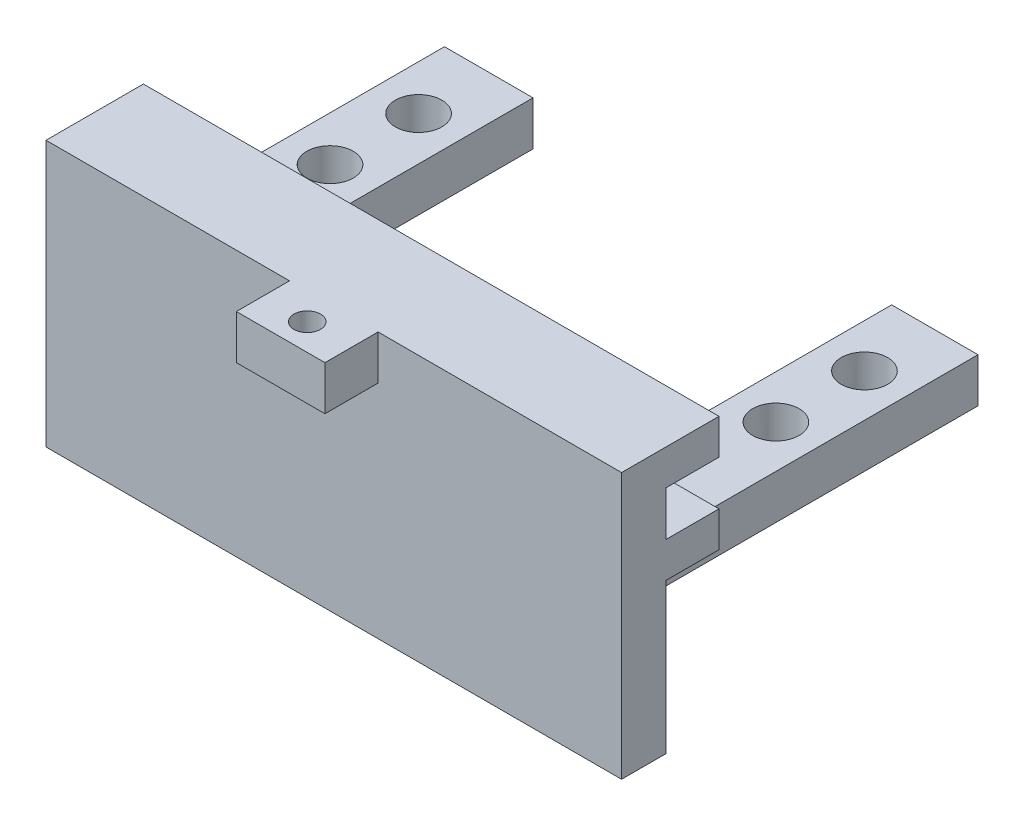
ISO-10303-21;
HEADER;
FILE_DESCRIPTION(('STEP AP214'),'2;1');
FILE_NAME('part.step','',(''),(''),'','','');
FILE_SCHEMA(('AUTOMOTIVE_DESIGN { 1 0 10303 214 1 1 1 1 }'));
ENDSEC;
DATA;
#1=APPLICATION_CONTEXT('core data for automotive mechanical design processes');
#2=APPLICATION_PROTOCOL_DEFINITION('international standard','automotive_design',2000,#1);
#3=PRODUCT_CONTEXT('',#1,'mechanical');
#4=PRODUCT('Part','Part','',(#3));
#5=PRODUCT_RELATED_PRODUCT_CATEGORY('part','',(#4));
#6=PRODUCT_DEFINITION_FORMATION('','',#4);
#7=PRODUCT_DEFINITION_CONTEXT('part definition',#1,'design');
#8=PRODUCT_DEFINITION('design','',#6,#7);
#9=PRODUCT_DEFINITION_SHAPE('','',#8);
#10=(LENGTH_UNIT() NAMED_UNIT(*) SI_UNIT(.MILLI.,.METRE.));
#11=(NAMED_UNIT(*) PLANE_ANGLE_UNIT() SI_UNIT($,.RADIAN.));
#12=(NAMED_UNIT(*) SI_UNIT($,.STERADIAN.) SOLID_ANGLE_UNIT());
#13=UNCERTAINTY_MEASURE_WITH_UNIT(LENGTH_MEASURE(1.E-05),#10,'distance_accuracy_value','');
#14=(GEOMETRIC_REPRESENTATION_CONTEXT(3) GLOBAL_UNCERTAINTY_ASSIGNED_CONTEXT((#13)) GLOBAL_UNIT_ASSIGNED_CONTEXT((#10,
#11,#12)) REPRESENTATION_CONTEXT('',''));
#15=CARTESIAN_POINT('',(0.,0.,0.));
#16=DIRECTION('',(0.,0.,1.));
#17=DIRECTION('',(1.,0.,0.));
#18=AXIS2_PLACEMENT_3D('',#15,#16,#17);
#19=CARTESIAN_POINT('',(0.,0.,0.));
#20=DIRECTION('',(0.,0.,-1.));
#21=DIRECTION('',(1.,0.,0.));
#22=AXIS2_PLACEMENT_3D('',#19,#20,#21);
#23=PLANE('',#22);
#24=DIRECTION('',(0.,1.,0.));
#25=VECTOR('',#24,1.);
#26=CARTESIAN_POINT('',(-7.50000000000002,10.,0.));
#27=LINE('',#26,#25);
#28=CARTESIAN_POINT('',(-7.50000000000002,10.,0.));
#29=VERTEX_POINT('',#28);
#30=CARTESIAN_POINT('',(-7.50000000000002,15.,0.));
#31=VERTEX_POINT('',#30);
#32=EDGE_CURVE('E210',#29,#31,#27,.T.);
#33=ORIENTED_EDGE('',*,*,#32,.T.);
#34=DIRECTION('',(-1.,0.,0.));
#35=VECTOR('',#34,1.);
#36=CARTESIAN_POINT('',(-30.,15.,0.));
#37=LINE('',#36,#35);
#38=CARTESIAN_POINT('',(-35.,15.,0.));
#39=VERTEX_POINT('',#38);
#40=EDGE_CURVE('E369',#31,#39,#37,.T.);
#41=ORIENTED_EDGE('',*,*,#40,.T.);
#42=DIRECTION('',(0.,-1.,0.));
#43=VECTOR('',#42,1.);
#44=CARTESIAN_POINT('',(-35.,15.,0.));
#45=LINE('',#44,#43);
#46=CARTESIAN_POINT('',(-35.,-15.,0.));
#47=VERTEX_POINT('',#46);
#48=EDGE_CURVE('E263',#39,#47,#45,.T.);
#49=ORIENTED_EDGE('',*,*,#48,.T.);
#50=DIRECTION('',(1.,0.,0.));
#51=VECTOR('',#50,1.);
#52=CARTESIAN_POINT('',(-30.,-15.,0.));
#53=LINE('',#52,#51);
#54=CARTESIAN_POINT('',(30.,-15.,0.));
#55=VERTEX_POINT('',#54);
#56=EDGE_CURVE('E372',#47,#55,#53,.T.);
#57=ORIENTED_EDGE('',*,*,#56,.T.);
#58=DIRECTION('',(0.,1.,0.));
#59=VECTOR('',#58,1.);
#60=CARTESIAN_POINT('',(30.,15.,0.));
#61=LINE('',#60,#59);
#62=CARTESIAN_POINT('',(30.,15.,0.));
#63=VERTEX_POINT('',#62);
#64=EDGE_CURVE('E359',#55,#63,#61,.T.);
#65=ORIENTED_EDGE('',*,*,#64,.T.);
#66=CARTESIAN_POINT('',(2.49999999999998,15.,0.));
#67=VERTEX_POINT('',#66);
#68=EDGE_CURVE('E370',#63,#67,#37,.T.);
#69=ORIENTED_EDGE('',*,*,#68,.T.);
#70=DIRECTION('',(0.,1.,0.));
#71=VECTOR('',#70,1.);
#72=CARTESIAN_POINT('',(2.49999999999998,10.,0.));
#73=LINE('',#72,#71);
#74=CARTESIAN_POINT('',(2.49999999999998,10.,0.));
#75=VERTEX_POINT('',#74);
#76=EDGE_CURVE('E212',#75,#67,#73,.T.);
#77=ORIENTED_EDGE('',*,*,#76,.F.);
#78=DIRECTION('',(1.,0.,0.));
#79=VECTOR('',#78,1.);
#80=CARTESIAN_POINT('',(-7.50000000000002,10.,0.));
#81=LINE('',#80,#79);
#82=EDGE_CURVE('E198',#29,#75,#81,.T.);
#83=ORIENTED_EDGE('',*,*,#82,.F.);
#84=EDGE_LOOP('',(#33,#41,#49,#57,#65,#69,#77,#83));
#85=FACE_BOUND('',#84,.T.);
#86=ADVANCED_FACE('F41',(#85),#23,.F.);
#87=CARTESIAN_POINT('',(0.,0.,-5.));
#88=DIRECTION('',(0.,0.,-1.));
#89=DIRECTION('',(1.,0.,0.));
#90=AXIS2_PLACEMENT_3D('',#87,#88,#89);
#91=PLANE('',#90);
#92=DIRECTION('',(0.,1.,0.));
#93=VECTOR('',#92,1.);
#94=CARTESIAN_POINT('',(-35.,-15.,-5.));
#95=LINE('',#94,#93);
#96=CARTESIAN_POINT('',(-35.,1.64999999999999,-5.));
#97=VERTEX_POINT('',#96);
#98=CARTESIAN_POINT('',(-35.,1.95,-5.));
#99=VERTEX_POINT('',#98);
#100=EDGE_CURVE('E242',#97,#99,#95,.T.);
#101=ORIENTED_EDGE('',*,*,#100,.T.);
#102=DIRECTION('',(1.,0.,0.));
#103=VECTOR('',#102,1.);
#104=CARTESIAN_POINT('',(-30.,1.95,-5.));
#105=LINE('',#104,#103);
#106=CARTESIAN_POINT('',(30.,1.95,-5.));
#107=VERTEX_POINT('',#106);
#108=EDGE_CURVE('E337',#99,#107,#105,.T.);
#109=ORIENTED_EDGE('',*,*,#108,.T.);
#110=DIRECTION('',(0.,1.,0.));
#111=VECTOR('',#110,1.);
#112=CARTESIAN_POINT('',(30.,15.,-5.));
#113=LINE('',#112,#111);
#114=CARTESIAN_POINT('',(30.,-15.,-5.));
#115=VERTEX_POINT('',#114);
#116=EDGE_CURVE('E360',#115,#107,#113,.T.);
#117=ORIENTED_EDGE('',*,*,#116,.F.);
#118=DIRECTION('',(1.,0.,0.));
#119=VECTOR('',#118,1.);
#120=CARTESIAN_POINT('',(-30.,-15.,-5.));
#121=LINE('',#120,#119);
#122=CARTESIAN_POINT('',(-35.,-15.,-5.));
#123=VERTEX_POINT('',#122);
#124=EDGE_CURVE('E363',#123,#115,#121,.T.);
#125=ORIENTED_EDGE('',*,*,#124,.F.);
#126=CARTESIAN_POINT('',(-35.,-3.35000000000001,-5.));
#127=VERTEX_POINT('',#126);
#128=EDGE_CURVE('E243',#123,#127,#95,.T.);
#129=ORIENTED_EDGE('',*,*,#128,.T.);
#130=DIRECTION('',(1.,0.,0.));
#131=VECTOR('',#130,1.);
#132=CARTESIAN_POINT('',(-30.,-3.35000000000001,-5.));
#133=LINE('',#132,#131);
#134=CARTESIAN_POINT('',(-25.,-3.35000000000001,-5.));
#135=VERTEX_POINT('',#134);
#136=EDGE_CURVE('E305',#127,#135,#133,.T.);
#137=ORIENTED_EDGE('',*,*,#136,.T.);
#138=DIRECTION('',(0.,1.,0.));
#139=VECTOR('',#138,1.);
#140=CARTESIAN_POINT('',(-25.,-3.35000000000001,-5.));
#141=LINE('',#140,#139);
#142=CARTESIAN_POINT('',(-25.,1.64999999999999,-5.));
#143=VERTEX_POINT('',#142);
#144=EDGE_CURVE('E322',#135,#143,#141,.T.);
#145=ORIENTED_EDGE('',*,*,#144,.T.);
#146=DIRECTION('',(-1.,0.,0.));
#147=VECTOR('',#146,1.);
#148=CARTESIAN_POINT('',(-30.,1.64999999999999,-5.));
#149=LINE('',#148,#147);
#150=EDGE_CURVE('E314',#143,#97,#149,.T.);
#151=ORIENTED_EDGE('',*,*,#150,.T.);
#152=EDGE_LOOP('',(#101,#109,#117,#125,#129,#137,#145,#151));
#153=FACE_BOUND('',#152,.T.);
#154=DIRECTION('',(0.,-1.,0.));
#155=VECTOR('',#154,1.);
#156=CARTESIAN_POINT('',(15.5,1.64999999999999,-5.));
#157=LINE('',#156,#155);
#158=CARTESIAN_POINT('',(15.5,1.64999999999999,-5.));
#159=VERTEX_POINT('',#158);
#160=CARTESIAN_POINT('',(15.5,-3.35000000000001,-5.));
#161=VERTEX_POINT('',#160);
#162=EDGE_CURVE('E227',#159,#161,#157,.T.);
#163=ORIENTED_EDGE('',*,*,#162,.T.);
#164=DIRECTION('',(1.,0.,0.));
#165=VECTOR('',#164,1.);
#166=CARTESIAN_POINT('',(22.25,-3.35000000000001,-5.));
#167=LINE('',#166,#165);
#168=CARTESIAN_POINT('',(25.25,-3.35000000000001,-5.));
#169=VERTEX_POINT('',#168);
#170=EDGE_CURVE('E302',#161,#169,#167,.T.);
#171=ORIENTED_EDGE('',*,*,#170,.T.);
#172=DIRECTION('',(0.,1.,0.));
#173=VECTOR('',#172,1.);
#174=CARTESIAN_POINT('',(25.25,-3.35000000000001,-5.));
#175=LINE('',#174,#173);
#176=CARTESIAN_POINT('',(25.25,1.64999999999999,-5.));
#177=VERTEX_POINT('',#176);
#178=EDGE_CURVE('E289',#169,#177,#175,.T.);
#179=ORIENTED_EDGE('',*,*,#178,.T.);
#180=DIRECTION('',(-1.,0.,0.));
#181=VECTOR('',#180,1.);
#182=CARTESIAN_POINT('',(22.25,1.64999999999999,-5.));
#183=LINE('',#182,#181);
#184=EDGE_CURVE('E297',#177,#159,#183,.T.);
#185=ORIENTED_EDGE('',*,*,#184,.T.);
#186=EDGE_LOOP('',(#163,#171,#179,#185));
#187=FACE_BOUND('',#186,.T.);
#188=ADVANCED_FACE('F394',(#153,#187),#91,.T.);
#189=CARTESIAN_POINT('',(30.,15.,-5.));
#190=DIRECTION('',(-1.,0.,0.));
#191=DIRECTION('',(0.,-1.,0.));
#192=AXIS2_PLACEMENT_3D('',#189,#190,#191);
#193=PLANE('',#192);
#194=ORIENTED_EDGE('',*,*,#64,.F.);
#195=DIRECTION('',(0.,0.,1.));
#196=VECTOR('',#195,1.);
#197=CARTESIAN_POINT('',(30.,-15.,-5.));
#198=LINE('',#197,#196);
#199=EDGE_CURVE('E50',#115,#55,#198,.T.);
#200=ORIENTED_EDGE('',*,*,#199,.F.);
#201=ORIENTED_EDGE('',*,*,#116,.T.);
#202=DIRECTION('',(0.,0.,1.));
#203=VECTOR('',#202,1.);
#204=CARTESIAN_POINT('',(30.,1.95,-11.));
#205=LINE('',#204,#203);
#206=CARTESIAN_POINT('',(30.,1.95,-11.));
#207=VERTEX_POINT('',#206);
#208=EDGE_CURVE('E329',#207,#107,#205,.T.);
#209=ORIENTED_EDGE('',*,*,#208,.F.);
#210=DIRECTION('',(0.,-1.,0.));
#211=VECTOR('',#210,1.);
#212=CARTESIAN_POINT('',(30.,5.95,-11.));
#213=LINE('',#212,#211);
#214=CARTESIAN_POINT('',(30.,5.95,-11.));
#215=VERTEX_POINT('',#214);
#216=EDGE_CURVE('E343',#215,#207,#213,.T.);
#217=ORIENTED_EDGE('',*,*,#216,.F.);
#218=DIRECTION('',(0.,0.,1.));
#219=VECTOR('',#218,1.);
#220=CARTESIAN_POINT('',(30.,5.95,-11.));
#221=LINE('',#220,#219);
#222=CARTESIAN_POINT('',(30.,5.95,-5.));
#223=VERTEX_POINT('',#222);
#224=EDGE_CURVE('E331',#215,#223,#221,.T.);
#225=ORIENTED_EDGE('',*,*,#224,.T.);
#226=CARTESIAN_POINT('',(30.,11.,-5.));
#227=VERTEX_POINT('',#226);
#228=EDGE_CURVE('E364',#223,#227,#113,.T.);
#229=ORIENTED_EDGE('',*,*,#228,.T.);
#230=DIRECTION('',(0.,0.,1.));
#231=VECTOR('',#230,1.);
#232=CARTESIAN_POINT('',(30.,11.,-11.));
#233=LINE('',#232,#231);
#234=CARTESIAN_POINT('',(30.,11.,-11.));
#235=VERTEX_POINT('',#234);
#236=EDGE_CURVE('E355',#235,#227,#233,.T.);
#237=ORIENTED_EDGE('',*,*,#236,.F.);
#238=DIRECTION('',(0.,1.,0.));
#239=VECTOR('',#238,1.);
#240=CARTESIAN_POINT('',(30.,0.,-11.));
#241=LINE('',#240,#239);
#242=CARTESIAN_POINT('',(30.,15.,-11.));
#243=VERTEX_POINT('',#242);
#244=EDGE_CURVE('E349',#235,#243,#241,.T.);
#245=ORIENTED_EDGE('',*,*,#244,.T.);
#246=DIRECTION('',(0.,0.,1.));
#247=VECTOR('',#246,1.);
#248=CARTESIAN_POINT('',(30.,15.,-5.));
#249=LINE('',#248,#247);
#250=EDGE_CURVE('E11',#243,#63,#249,.T.);
#251=ORIENTED_EDGE('',*,*,#250,.T.);
#252=EDGE_LOOP('',(#194,#200,#201,#209,#217,#225,#229,#237,#245,#251));
#253=FACE_BOUND('',#252,.T.);
#254=ADVANCED_FACE('F43',(#253),#193,.F.);
#255=CARTESIAN_POINT('',(-30.,15.,-5.));
#256=DIRECTION('',(0.,-1.,0.));
#257=DIRECTION('',(0.,0.,1.));
#258=AXIS2_PLACEMENT_3D('',#255,#256,#257);
#259=PLANE('',#258);
#260=ORIENTED_EDGE('',*,*,#68,.F.);
#261=ORIENTED_EDGE('',*,*,#250,.F.);
#262=DIRECTION('',(-1.,0.,0.));
#263=VECTOR('',#262,1.);
#264=CARTESIAN_POINT('',(0.,15.,-11.));
#265=LINE('',#264,#263);
#266=CARTESIAN_POINT('',(-35.,15.,-11.));
#267=VERTEX_POINT('',#266);
#268=EDGE_CURVE('E352',#243,#267,#265,.T.);
#269=ORIENTED_EDGE('',*,*,#268,.T.);
#270=DIRECTION('',(0.,0.,1.));
#271=VECTOR('',#270,1.);
#272=CARTESIAN_POINT('',(-35.,15.,-11.));
#273=LINE('',#272,#271);
#274=EDGE_CURVE('E261',#267,#39,#273,.T.);
#275=ORIENTED_EDGE('',*,*,#274,.T.);
#276=ORIENTED_EDGE('',*,*,#40,.F.);
#277=DIRECTION('',(0.,0.,-1.));
#278=VECTOR('',#277,1.);
#279=CARTESIAN_POINT('',(-7.50000000000002,15.,6.));
#280=LINE('',#279,#278);
#281=CARTESIAN_POINT('',(-7.50000000000002,15.,6.));
#282=VERTEX_POINT('',#281);
#283=EDGE_CURVE('E217',#282,#31,#280,.T.);
#284=ORIENTED_EDGE('',*,*,#283,.F.);
#285=DIRECTION('',(-1.,0.,0.));
#286=VECTOR('',#285,1.);
#287=CARTESIAN_POINT('',(2.49999999999998,15.,6.));
#288=LINE('',#287,#286);
#289=CARTESIAN_POINT('',(2.49999999999998,15.,6.));
#290=VERTEX_POINT('',#289);
#291=EDGE_CURVE('E205',#290,#282,#288,.T.);
#292=ORIENTED_EDGE('',*,*,#291,.F.);
#293=DIRECTION('',(0.,0.,1.));
#294=VECTOR('',#293,1.);
#295=CARTESIAN_POINT('',(2.49999999999998,15.,0.));
#296=LINE('',#295,#294);
#297=EDGE_CURVE('E58',#67,#290,#296,.T.);
#298=ORIENTED_EDGE('',*,*,#297,.F.);
#299=EDGE_LOOP('',(#260,#261,#269,#275,#276,#284,#292,#298));
#300=FACE_BOUND('',#299,.T.);
#301=CARTESIAN_POINT('',(-2.50000000000002,15.,3.));
#302=DIRECTION('',(0.,-1.,0.));
#303=DIRECTION('',(0.,0.,-1.));
#304=AXIS2_PLACEMENT_3D('',#301,#302,#303);
#305=CIRCLE('',#304,1.5);
#306=CARTESIAN_POINT('',(-2.50000000000002,15.,1.5));
#307=VERTEX_POINT('',#306);
#308=EDGE_CURVE('E454',#307,#307,#305,.T.);
#309=ORIENTED_EDGE('',*,*,#308,.T.);
#310=EDGE_LOOP('',(#309));
#311=FACE_BOUND('',#310,.T.);
#312=ADVANCED_FACE('F445',(#300,#311),#259,.F.);
#313=CARTESIAN_POINT('',(-30.,-15.,-5.));
#314=DIRECTION('',(0.,1.,0.));
#315=DIRECTION('',(0.,0.,-1.));
#316=AXIS2_PLACEMENT_3D('',#313,#314,#315);
#317=PLANE('',#316);
#318=ORIENTED_EDGE('',*,*,#56,.F.);
#319=DIRECTION('',(0.,0.,-1.));
#320=VECTOR('',#319,1.);
#321=CARTESIAN_POINT('',(-35.,-15.,0.));
#322=LINE('',#321,#320);
#323=EDGE_CURVE('E266',#47,#123,#322,.T.);
#324=ORIENTED_EDGE('',*,*,#323,.T.);
#325=ORIENTED_EDGE('',*,*,#124,.T.);
#326=ORIENTED_EDGE('',*,*,#199,.T.);
#327=EDGE_LOOP('',(#318,#324,#325,#326));
#328=FACE_BOUND('',#327,.T.);
#329=ADVANCED_FACE('F416',(#328),#317,.F.);
#330=DIRECTION('',(1.,0.,0.));
#331=VECTOR('',#330,1.);
#332=CARTESIAN_POINT('',(-30.,5.95,-5.));
#333=LINE('',#332,#331);
#334=CARTESIAN_POINT('',(-35.,5.95,-5.));
#335=VERTEX_POINT('',#334);
#336=EDGE_CURVE('E335',#335,#223,#333,.T.);
#337=ORIENTED_EDGE('',*,*,#336,.F.);
#338=DIRECTION('',(0.,1.,0.));
#339=VECTOR('',#338,1.);
#340=CARTESIAN_POINT('',(-35.,5.95,-5.));
#341=LINE('',#340,#339);
#342=CARTESIAN_POINT('',(-35.,11.,-5.));
#343=VERTEX_POINT('',#342);
#344=EDGE_CURVE('E253',#335,#343,#341,.T.);
#345=ORIENTED_EDGE('',*,*,#344,.T.);
#346=DIRECTION('',(1.,0.,0.));
#347=VECTOR('',#346,1.);
#348=CARTESIAN_POINT('',(0.,11.,-5.));
#349=LINE('',#348,#347);
#350=EDGE_CURVE('E341',#343,#227,#349,.T.);
#351=ORIENTED_EDGE('',*,*,#350,.T.);
#352=ORIENTED_EDGE('',*,*,#228,.F.);
#353=EDGE_LOOP('',(#337,#345,#351,#352));
#354=FACE_BOUND('',#353,.T.);
#355=ADVANCED_FACE('F441',(#354),#91,.T.);
#356=CARTESIAN_POINT('',(0.,11.,-11.));
#357=DIRECTION('',(0.,1.,0.));
#358=DIRECTION('',(0.,0.,-1.));
#359=AXIS2_PLACEMENT_3D('',#356,#357,#358);
#360=PLANE('',#359);
#361=ORIENTED_EDGE('',*,*,#350,.F.);
#362=DIRECTION('',(0.,0.,-1.));
#363=VECTOR('',#362,1.);
#364=CARTESIAN_POINT('',(-35.,11.,-5.));
#365=LINE('',#364,#363);
#366=CARTESIAN_POINT('',(-35.,11.,-11.));
#367=VERTEX_POINT('',#366);
#368=EDGE_CURVE('E256',#343,#367,#365,.T.);
#369=ORIENTED_EDGE('',*,*,#368,.T.);
#370=DIRECTION('',(1.,0.,0.));
#371=VECTOR('',#370,1.);
#372=CARTESIAN_POINT('',(0.,11.,-11.));
#373=LINE('',#372,#371);
#374=EDGE_CURVE('E347',#367,#235,#373,.T.);
#375=ORIENTED_EDGE('',*,*,#374,.T.);
#376=ORIENTED_EDGE('',*,*,#236,.T.);
#377=EDGE_LOOP('',(#361,#369,#375,#376));
#378=FACE_BOUND('',#377,.T.);
#379=ADVANCED_FACE('F479',(#378),#360,.F.);
#380=CARTESIAN_POINT('',(0.,0.,-11.));
#381=DIRECTION('',(0.,0.,-1.));
#382=DIRECTION('',(1.,0.,0.));
#383=AXIS2_PLACEMENT_3D('',#380,#381,#382);
#384=PLANE('',#383);
#385=ORIENTED_EDGE('',*,*,#268,.F.);
#386=ORIENTED_EDGE('',*,*,#244,.F.);
#387=ORIENTED_EDGE('',*,*,#374,.F.);
#388=DIRECTION('',(0.,1.,0.));
#389=VECTOR('',#388,1.);
#390=CARTESIAN_POINT('',(-35.,11.,-11.));
#391=LINE('',#390,#389);
#392=EDGE_CURVE('E259',#367,#267,#391,.T.);
#393=ORIENTED_EDGE('',*,*,#392,.T.);
#394=EDGE_LOOP('',(#385,#386,#387,#393));
#395=FACE_BOUND('',#394,.T.);
#396=ADVANCED_FACE('F475',(#395),#384,.T.);
#397=CARTESIAN_POINT('',(-30.,1.95,-11.));
#398=DIRECTION('',(0.,1.,0.));
#399=DIRECTION('',(-1.,0.,0.));
#400=AXIS2_PLACEMENT_3D('',#397,#398,#399);
#401=PLANE('',#400);
#402=ORIENTED_EDGE('',*,*,#108,.F.);
#403=DIRECTION('',(0.,0.,-1.));
#404=VECTOR('',#403,1.);
#405=CARTESIAN_POINT('',(-35.,1.95,-5.));
#406=LINE('',#405,#404);
#407=CARTESIAN_POINT('',(-35.,1.95,-11.));
#408=VERTEX_POINT('',#407);
#409=EDGE_CURVE('E246',#99,#408,#406,.T.);
#410=ORIENTED_EDGE('',*,*,#409,.T.);
#411=DIRECTION('',(1.,0.,0.));
#412=VECTOR('',#411,1.);
#413=CARTESIAN_POINT('',(-30.,1.95,-11.));
#414=LINE('',#413,#412);
#415=EDGE_CURVE('E338',#408,#207,#414,.T.);
#416=ORIENTED_EDGE('',*,*,#415,.T.);
#417=ORIENTED_EDGE('',*,*,#208,.T.);
#418=EDGE_LOOP('',(#402,#410,#416,#417));
#419=FACE_BOUND('',#418,.T.);
#420=ADVANCED_FACE('F408',(#419),#401,.F.);
#421=CARTESIAN_POINT('',(-30.,5.95,-11.));
#422=DIRECTION('',(0.,1.,0.));
#423=DIRECTION('',(-1.,0.,0.));
#424=AXIS2_PLACEMENT_3D('',#421,#422,#423);
#425=PLANE('',#424);
#426=ORIENTED_EDGE('',*,*,#336,.T.);
#427=ORIENTED_EDGE('',*,*,#224,.F.);
#428=DIRECTION('',(1.,0.,0.));
#429=VECTOR('',#428,1.);
#430=CARTESIAN_POINT('',(-30.,5.95,-11.));
#431=LINE('',#430,#429);
#432=CARTESIAN_POINT('',(-35.,5.95,-11.));
#433=VERTEX_POINT('',#432);
#434=EDGE_CURVE('E334',#433,#215,#431,.T.);
#435=ORIENTED_EDGE('',*,*,#434,.F.);
#436=DIRECTION('',(0.,0.,1.));
#437=VECTOR('',#436,1.);
#438=CARTESIAN_POINT('',(-35.,5.95,-11.));
#439=LINE('',#438,#437);
#440=EDGE_CURVE('E251',#433,#335,#439,.T.);
#441=ORIENTED_EDGE('',*,*,#440,.T.);
#442=EDGE_LOOP('',(#426,#427,#435,#441));
#443=FACE_BOUND('',#442,.T.);
#444=ADVANCED_FACE('F429',(#443),#425,.T.);
#445=CARTESIAN_POINT('',(0.,0.,-11.));
#446=DIRECTION('',(0.,0.,1.));
#447=DIRECTION('',(-1.,0.,0.));
#448=AXIS2_PLACEMENT_3D('',#445,#446,#447);
#449=PLANE('',#448);
#450=ORIENTED_EDGE('',*,*,#415,.F.);
#451=DIRECTION('',(0.,1.,0.));
#452=VECTOR('',#451,1.);
#453=CARTESIAN_POINT('',(-35.,1.95,-11.));
#454=LINE('',#453,#452);
#455=EDGE_CURVE('E249',#408,#433,#454,.T.);
#456=ORIENTED_EDGE('',*,*,#455,.T.);
#457=ORIENTED_EDGE('',*,*,#434,.T.);
#458=ORIENTED_EDGE('',*,*,#216,.T.);
#459=EDGE_LOOP('',(#450,#456,#457,#458));
#460=FACE_BOUND('',#459,.T.);
#461=ADVANCED_FACE('F421',(#460),#449,.F.);
#462=CARTESIAN_POINT('',(-30.,-3.35000000000001,-45.));
#463=DIRECTION('',(0.,1.,0.));
#464=DIRECTION('',(0.,0.,-1.));
#465=AXIS2_PLACEMENT_3D('',#462,#463,#464);
#466=PLANE('',#465);
#467=CARTESIAN_POINT('',(-29.925,-3.35000000000001,-37.));
#468=DIRECTION('',(0.,1.,0.));
#469=DIRECTION('',(0.,0.,1.));
#470=AXIS2_PLACEMENT_3D('',#467,#468,#469);
#471=CIRCLE('',#470,2.625);
#472=CARTESIAN_POINT('',(-29.925,-3.35000000000001,-34.375));
#473=VERTEX_POINT('',#472);
#474=EDGE_CURVE('E268',#473,#473,#471,.T.);
#475=ORIENTED_EDGE('',*,*,#474,.T.);
#476=EDGE_LOOP('',(#475));
#477=FACE_BOUND('',#476,.T.);
#478=CARTESIAN_POINT('',(-29.925,-3.35000000000001,-27.));
#479=DIRECTION('',(0.,1.,0.));
#480=DIRECTION('',(0.,0.,1.));
#481=AXIS2_PLACEMENT_3D('',#478,#479,#480);
#482=CIRCLE('',#481,2.625);
#483=CARTESIAN_POINT('',(-29.925,-3.35000000000001,-24.375));
#484=VERTEX_POINT('',#483);
#485=EDGE_CURVE('E273',#484,#484,#482,.T.);
#486=ORIENTED_EDGE('',*,*,#485,.T.);
#487=EDGE_LOOP('',(#486));
#488=FACE_BOUND('',#487,.T.);
#489=ORIENTED_EDGE('',*,*,#136,.F.);
#490=DIRECTION('',(0.,0.,-1.));
#491=VECTOR('',#490,1.);
#492=CARTESIAN_POINT('',(-35.,-3.35000000000001,-5.));
#493=LINE('',#492,#491);
#494=CARTESIAN_POINT('',(-35.,-3.35000000000001,-45.));
#495=VERTEX_POINT('',#494);
#496=EDGE_CURVE('E239',#127,#495,#493,.T.);
#497=ORIENTED_EDGE('',*,*,#496,.T.);
#498=DIRECTION('',(1.,0.,0.));
#499=VECTOR('',#498,1.);
#500=CARTESIAN_POINT('',(-30.,-3.35000000000001,-45.));
#501=LINE('',#500,#499);
#502=CARTESIAN_POINT('',(-25.,-3.35000000000001,-45.));
#503=VERTEX_POINT('',#502);
#504=EDGE_CURVE('E310',#495,#503,#501,.T.);
#505=ORIENTED_EDGE('',*,*,#504,.T.);
#506=DIRECTION('',(0.,0.,1.));
#507=VECTOR('',#506,1.);
#508=CARTESIAN_POINT('',(-25.,-3.35000000000001,-45.));
#509=LINE('',#508,#507);
#510=EDGE_CURVE('E327',#503,#135,#509,.T.);
#511=ORIENTED_EDGE('',*,*,#510,.T.);
#512=EDGE_LOOP('',(#489,#497,#505,#511));
#513=FACE_BOUND('',#512,.T.);
#514=ADVANCED_FACE('F419',(#477,#488,#513),#466,.F.);
#515=CARTESIAN_POINT('',(-25.,-3.35000000000001,-45.));
#516=DIRECTION('',(-1.,0.,0.));
#517=DIRECTION('',(0.,-1.,0.));
#518=AXIS2_PLACEMENT_3D('',#515,#516,#517);
#519=PLANE('',#518);
#520=ORIENTED_EDGE('',*,*,#144,.F.);
#521=ORIENTED_EDGE('',*,*,#510,.F.);
#522=DIRECTION('',(0.,1.,0.));
#523=VECTOR('',#522,1.);
#524=CARTESIAN_POINT('',(-25.,-3.35000000000001,-45.));
#525=LINE('',#524,#523);
#526=CARTESIAN_POINT('',(-25.,1.64999999999999,-45.));
#527=VERTEX_POINT('',#526);
#528=EDGE_CURVE('E313',#503,#527,#525,.T.);
#529=ORIENTED_EDGE('',*,*,#528,.T.);
#530=DIRECTION('',(0.,0.,1.));
#531=VECTOR('',#530,1.);
#532=CARTESIAN_POINT('',(-25.,1.64999999999999,-45.));
#533=LINE('',#532,#531);
#534=EDGE_CURVE('E319',#527,#143,#533,.T.);
#535=ORIENTED_EDGE('',*,*,#534,.T.);
#536=EDGE_LOOP('',(#520,#521,#529,#535));
#537=FACE_BOUND('',#536,.T.);
#538=ADVANCED_FACE('F387',(#537),#519,.F.);
#539=CARTESIAN_POINT('',(-30.,1.64999999999999,-45.));
#540=DIRECTION('',(0.,-1.,0.));
#541=DIRECTION('',(0.,0.,1.));
#542=AXIS2_PLACEMENT_3D('',#539,#540,#541);
#543=PLANE('',#542);
#544=CARTESIAN_POINT('',(-29.925,1.65,-37.));
#545=DIRECTION('',(0.,1.,0.));
#546=DIRECTION('',(0.,0.,1.));
#547=AXIS2_PLACEMENT_3D('',#544,#545,#546);
#548=CIRCLE('',#547,2.625);
#549=CARTESIAN_POINT('',(-29.925,1.65,-34.375));
#550=VERTEX_POINT('',#549);
#551=EDGE_CURVE('E45',#550,#550,#548,.T.);
#552=ORIENTED_EDGE('',*,*,#551,.F.);
#553=EDGE_LOOP('',(#552));
#554=FACE_BOUND('',#553,.T.);
#555=CARTESIAN_POINT('',(-29.925,1.65,-27.));
#556=DIRECTION('',(0.,1.,0.));
#557=DIRECTION('',(0.,0.,1.));
#558=AXIS2_PLACEMENT_3D('',#555,#556,#557);
#559=CIRCLE('',#558,2.625);
#560=CARTESIAN_POINT('',(-29.925,1.65,-24.375));
#561=VERTEX_POINT('',#560);
#562=EDGE_CURVE('E286',#561,#561,#559,.T.);
#563=ORIENTED_EDGE('',*,*,#562,.F.);
#564=EDGE_LOOP('',(#563));
#565=FACE_BOUND('',#564,.T.);
#566=ORIENTED_EDGE('',*,*,#150,.F.);
#567=ORIENTED_EDGE('',*,*,#534,.F.);
#568=DIRECTION('',(-1.,0.,0.));
#569=VECTOR('',#568,1.);
#570=CARTESIAN_POINT('',(-30.,1.64999999999999,-45.));
#571=LINE('',#570,#569);
#572=CARTESIAN_POINT('',(-35.,1.64999999999999,-45.));
#573=VERTEX_POINT('',#572);
#574=EDGE_CURVE('E317',#527,#573,#571,.T.);
#575=ORIENTED_EDGE('',*,*,#574,.T.);
#576=DIRECTION('',(0.,0.,1.));
#577=VECTOR('',#576,1.);
#578=CARTESIAN_POINT('',(-35.,1.64999999999999,-45.));
#579=LINE('',#578,#577);
#580=EDGE_CURVE('E66',#573,#97,#579,.T.);
#581=ORIENTED_EDGE('',*,*,#580,.T.);
#582=EDGE_LOOP('',(#566,#567,#575,#581));
#583=FACE_BOUND('',#582,.T.);
#584=ADVANCED_FACE('F383',(#554,#565,#583),#543,.F.);
#585=CARTESIAN_POINT('',(0.,0.,-45.));
#586=DIRECTION('',(0.,0.,1.));
#587=DIRECTION('',(-1.,0.,0.));
#588=AXIS2_PLACEMENT_3D('',#585,#586,#587);
#589=PLANE('',#588);
#590=ORIENTED_EDGE('',*,*,#574,.F.);
#591=ORIENTED_EDGE('',*,*,#528,.F.);
#592=ORIENTED_EDGE('',*,*,#504,.F.);
#593=DIRECTION('',(0.,1.,0.));
#594=VECTOR('',#593,1.);
#595=CARTESIAN_POINT('',(-35.,-3.35000000000001,-45.));
#596=LINE('',#595,#594);
#597=EDGE_CURVE('E236',#495,#573,#596,.T.);
#598=ORIENTED_EDGE('',*,*,#597,.T.);
#599=EDGE_LOOP('',(#590,#591,#592,#598));
#600=FACE_BOUND('',#599,.T.);
#601=ADVANCED_FACE('F386',(#600),#589,.F.);
#602=CARTESIAN_POINT('',(22.25,1.64999999999999,-45.));
#603=DIRECTION('',(0.,-1.,0.));
#604=DIRECTION('',(1.,0.,0.));
#605=AXIS2_PLACEMENT_3D('',#602,#603,#604);
#606=PLANE('',#605);
#607=CARTESIAN_POINT('',(20.425,1.65,-27.));
#608=DIRECTION('',(0.,1.,0.));
#609=DIRECTION('',(1.,0.,0.));
#610=AXIS2_PLACEMENT_3D('',#607,#608,#609);
#611=CIRCLE('',#610,2.625);
#612=CARTESIAN_POINT('',(23.05,1.65,-27.));
#613=VERTEX_POINT('',#612);
#614=EDGE_CURVE('E283',#613,#613,#611,.T.);
#615=ORIENTED_EDGE('',*,*,#614,.F.);
#616=EDGE_LOOP('',(#615));
#617=FACE_BOUND('',#616,.T.);
#618=CARTESIAN_POINT('',(20.425,1.65,-37.));
#619=DIRECTION('',(0.,1.,0.));
#620=DIRECTION('',(1.,0.,0.));
#621=AXIS2_PLACEMENT_3D('',#618,#619,#620);
#622=CIRCLE('',#621,2.625);
#623=CARTESIAN_POINT('',(23.05,1.65,-37.));
#624=VERTEX_POINT('',#623);
#625=EDGE_CURVE('E280',#624,#624,#622,.T.);
#626=ORIENTED_EDGE('',*,*,#625,.F.);
#627=EDGE_LOOP('',(#626));
#628=FACE_BOUND('',#627,.T.);
#629=ORIENTED_EDGE('',*,*,#184,.F.);
#630=DIRECTION('',(0.,0.,-1.));
#631=VECTOR('',#630,1.);
#632=CARTESIAN_POINT('',(25.25,1.64999999999999,-5.));
#633=LINE('',#632,#631);
#634=CARTESIAN_POINT('',(25.25,1.64999999999999,-45.));
#635=VERTEX_POINT('',#634);
#636=EDGE_CURVE('E292',#177,#635,#633,.T.);
#637=ORIENTED_EDGE('',*,*,#636,.T.);
#638=DIRECTION('',(-1.,0.,0.));
#639=VECTOR('',#638,1.);
#640=CARTESIAN_POINT('',(22.25,1.64999999999999,-45.));
#641=LINE('',#640,#639);
#642=CARTESIAN_POINT('',(15.5,1.64999999999999,-45.));
#643=VERTEX_POINT('',#642);
#644=EDGE_CURVE('E298',#635,#643,#641,.T.);
#645=ORIENTED_EDGE('',*,*,#644,.T.);
#646=DIRECTION('',(0.,0.,1.));
#647=VECTOR('',#646,1.);
#648=CARTESIAN_POINT('',(15.5,1.64999999999999,-45.));
#649=LINE('',#648,#647);
#650=EDGE_CURVE('E225',#643,#159,#649,.T.);
#651=ORIENTED_EDGE('',*,*,#650,.T.);
#652=EDGE_LOOP('',(#629,#637,#645,#651));
#653=FACE_BOUND('',#652,.T.);
#654=ADVANCED_FACE('F646',(#617,#628,#653),#606,.F.);
#655=CARTESIAN_POINT('',(22.25,-3.35000000000001,-45.));
#656=DIRECTION('',(0.,1.,0.));
#657=DIRECTION('',(-1.,0.,0.));
#658=AXIS2_PLACEMENT_3D('',#655,#656,#657);
#659=PLANE('',#658);
#660=CARTESIAN_POINT('',(20.425,-3.35000000000001,-27.));
#661=DIRECTION('',(0.,1.,0.));
#662=DIRECTION('',(0.,0.,1.));
#663=AXIS2_PLACEMENT_3D('',#660,#661,#662);
#664=CIRCLE('',#663,2.625);
#665=CARTESIAN_POINT('',(20.425,-3.35000000000001,-24.375));
#666=VERTEX_POINT('',#665);
#667=EDGE_CURVE('E269',#666,#666,#664,.T.);
#668=ORIENTED_EDGE('',*,*,#667,.T.);
#669=EDGE_LOOP('',(#668));
#670=FACE_BOUND('',#669,.T.);
#671=CARTESIAN_POINT('',(20.425,-3.35000000000001,-37.));
#672=DIRECTION('',(0.,1.,0.));
#673=DIRECTION('',(0.,0.,1.));
#674=AXIS2_PLACEMENT_3D('',#671,#672,#673);
#675=CIRCLE('',#674,2.625);
#676=CARTESIAN_POINT('',(20.425,-3.35000000000001,-34.375));
#677=VERTEX_POINT('',#676);
#678=EDGE_CURVE('E272',#677,#677,#675,.T.);
#679=ORIENTED_EDGE('',*,*,#678,.T.);
#680=EDGE_LOOP('',(#679));
#681=FACE_BOUND('',#680,.T.);
#682=ORIENTED_EDGE('',*,*,#170,.F.);
#683=DIRECTION('',(0.,0.,-1.));
#684=VECTOR('',#683,1.);
#685=CARTESIAN_POINT('',(15.5,-3.35000000000001,-5.));
#686=LINE('',#685,#684);
#687=CARTESIAN_POINT('',(15.5,-3.35000000000001,-45.));
#688=VERTEX_POINT('',#687);
#689=EDGE_CURVE('E231',#161,#688,#686,.T.);
#690=ORIENTED_EDGE('',*,*,#689,.T.);
#691=DIRECTION('',(1.,0.,0.));
#692=VECTOR('',#691,1.);
#693=CARTESIAN_POINT('',(22.25,-3.35000000000001,-45.));
#694=LINE('',#693,#692);
#695=CARTESIAN_POINT('',(25.25,-3.35000000000001,-45.));
#696=VERTEX_POINT('',#695);
#697=EDGE_CURVE('E301',#688,#696,#694,.T.);
#698=ORIENTED_EDGE('',*,*,#697,.T.);
#699=DIRECTION('',(0.,0.,1.));
#700=VECTOR('',#699,1.);
#701=CARTESIAN_POINT('',(25.25,-3.35000000000001,-45.));
#702=LINE('',#701,#700);
#703=EDGE_CURVE('E287',#696,#169,#702,.T.);
#704=ORIENTED_EDGE('',*,*,#703,.T.);
#705=EDGE_LOOP('',(#682,#690,#698,#704));
#706=FACE_BOUND('',#705,.T.);
#707=ADVANCED_FACE('F663',(#670,#681,#706),#659,.F.);
#708=CARTESIAN_POINT('',(0.,0.,-45.));
#709=DIRECTION('',(0.,0.,-1.));
#710=DIRECTION('',(1.,0.,0.));
#711=AXIS2_PLACEMENT_3D('',#708,#709,#710);
#712=PLANE('',#711);
#713=ORIENTED_EDGE('',*,*,#697,.F.);
#714=DIRECTION('',(0.,1.,0.));
#715=VECTOR('',#714,1.);
#716=CARTESIAN_POINT('',(15.5,-3.35000000000001,-45.));
#717=LINE('',#716,#715);
#718=EDGE_CURVE('E234',#688,#643,#717,.T.);
#719=ORIENTED_EDGE('',*,*,#718,.T.);
#720=ORIENTED_EDGE('',*,*,#644,.F.);
#721=DIRECTION('',(0.,-1.,0.));
#722=VECTOR('',#721,1.);
#723=CARTESIAN_POINT('',(25.25,1.64999999999999,-45.));
#724=LINE('',#723,#722);
#725=EDGE_CURVE('E295',#635,#696,#724,.T.);
#726=ORIENTED_EDGE('',*,*,#725,.T.);
#727=EDGE_LOOP('',(#713,#719,#720,#726));
#728=FACE_BOUND('',#727,.T.);
#729=ADVANCED_FACE('F678',(#728),#712,.T.);
#730=CARTESIAN_POINT('',(25.25,0.,0.));
#731=DIRECTION('',(1.,0.,0.));
#732=DIRECTION('',(0.,0.,1.));
#733=AXIS2_PLACEMENT_3D('',#730,#731,#732);
#734=PLANE('',#733);
#735=ORIENTED_EDGE('',*,*,#703,.F.);
#736=ORIENTED_EDGE('',*,*,#725,.F.);
#737=ORIENTED_EDGE('',*,*,#636,.F.);
#738=ORIENTED_EDGE('',*,*,#178,.F.);
#739=EDGE_LOOP('',(#735,#736,#737,#738));
#740=FACE_BOUND('',#739,.T.);
#741=ADVANCED_FACE('F693',(#740),#734,.T.);
#742=CARTESIAN_POINT('',(20.425,15.,-37.));
#743=DIRECTION('',(0.,-1.,0.));
#744=DIRECTION('',(0.,0.,1.));
#745=AXIS2_PLACEMENT_3D('',#742,#743,#744);
#746=CYLINDRICAL_SURFACE('',#745,2.625);
#747=ORIENTED_EDGE('',*,*,#678,.F.);
#748=EDGE_LOOP('',(#747));
#749=FACE_BOUND('',#748,.T.);
#750=ORIENTED_EDGE('',*,*,#625,.T.);
#751=EDGE_LOOP('',(#750));
#752=FACE_BOUND('',#751,.T.);
#753=ADVANCED_FACE('F708',(#749,#752),#746,.F.);
#754=CARTESIAN_POINT('',(20.425,15.,-27.));
#755=DIRECTION('',(0.,-1.,0.));
#756=DIRECTION('',(0.,0.,1.));
#757=AXIS2_PLACEMENT_3D('',#754,#755,#756);
#758=CYLINDRICAL_SURFACE('',#757,2.625);
#759=ORIENTED_EDGE('',*,*,#667,.F.);
#760=EDGE_LOOP('',(#759));
#761=FACE_BOUND('',#760,.T.);
#762=ORIENTED_EDGE('',*,*,#614,.T.);
#763=EDGE_LOOP('',(#762));
#764=FACE_BOUND('',#763,.T.);
#765=ADVANCED_FACE('F717',(#761,#764),#758,.F.);
#766=CARTESIAN_POINT('',(-29.925,15.,-27.));
#767=DIRECTION('',(0.,-1.,0.));
#768=DIRECTION('',(0.,0.,1.));
#769=AXIS2_PLACEMENT_3D('',#766,#767,#768);
#770=CYLINDRICAL_SURFACE('',#769,2.625);
#771=ORIENTED_EDGE('',*,*,#485,.F.);
#772=EDGE_LOOP('',(#771));
#773=FACE_BOUND('',#772,.T.);
#774=ORIENTED_EDGE('',*,*,#562,.T.);
#775=EDGE_LOOP('',(#774));
#776=FACE_BOUND('',#775,.T.);
#777=ADVANCED_FACE('F726',(#773,#776),#770,.F.);
#778=CARTESIAN_POINT('',(-29.925,15.,-37.));
#779=DIRECTION('',(0.,-1.,0.));
#780=DIRECTION('',(0.,0.,1.));
#781=AXIS2_PLACEMENT_3D('',#778,#779,#780);
#782=CYLINDRICAL_SURFACE('',#781,2.625);
#783=ORIENTED_EDGE('',*,*,#474,.F.);
#784=EDGE_LOOP('',(#783));
#785=FACE_BOUND('',#784,.T.);
#786=ORIENTED_EDGE('',*,*,#551,.T.);
#787=EDGE_LOOP('',(#786));
#788=FACE_BOUND('',#787,.T.);
#789=ADVANCED_FACE('F381',(#785,#788),#782,.F.);
#790=CARTESIAN_POINT('',(-35.,0.,0.));
#791=DIRECTION('',(1.,0.,0.));
#792=DIRECTION('',(0.,1.,0.));
#793=AXIS2_PLACEMENT_3D('',#790,#791,#792);
#794=PLANE('',#793);
#795=ORIENTED_EDGE('',*,*,#128,.F.);
#796=ORIENTED_EDGE('',*,*,#323,.F.);
#797=ORIENTED_EDGE('',*,*,#48,.F.);
#798=ORIENTED_EDGE('',*,*,#274,.F.);
#799=ORIENTED_EDGE('',*,*,#392,.F.);
#800=ORIENTED_EDGE('',*,*,#368,.F.);
#801=ORIENTED_EDGE('',*,*,#344,.F.);
#802=ORIENTED_EDGE('',*,*,#440,.F.);
#803=ORIENTED_EDGE('',*,*,#455,.F.);
#804=ORIENTED_EDGE('',*,*,#409,.F.);
#805=ORIENTED_EDGE('',*,*,#100,.F.);
#806=ORIENTED_EDGE('',*,*,#580,.F.);
#807=ORIENTED_EDGE('',*,*,#597,.F.);
#808=ORIENTED_EDGE('',*,*,#496,.F.);
#809=EDGE_LOOP('',(#795,#796,#797,#798,#799,#800,#801,#802,#803,#804,#805,#806,#807,#808));
#810=FACE_BOUND('',#809,.T.);
#811=ADVANCED_FACE('F403',(#810),#794,.F.);
#812=CARTESIAN_POINT('',(15.5,0.,0.));
#813=DIRECTION('',(-1.,0.,0.));
#814=DIRECTION('',(0.,0.,-1.));
#815=AXIS2_PLACEMENT_3D('',#812,#813,#814);
#816=PLANE('',#815);
#817=ORIENTED_EDGE('',*,*,#650,.F.);
#818=ORIENTED_EDGE('',*,*,#718,.F.);
#819=ORIENTED_EDGE('',*,*,#689,.F.);
#820=ORIENTED_EDGE('',*,*,#162,.F.);
#821=EDGE_LOOP('',(#817,#818,#819,#820));
#822=FACE_BOUND('',#821,.T.);
#823=ADVANCED_FACE('F751',(#822),#816,.T.);
#824=CARTESIAN_POINT('',(-7.50000000000002,10.,6.));
#825=DIRECTION('',(-1.,0.,0.));
#826=DIRECTION('',(0.,0.,-1.));
#827=AXIS2_PLACEMENT_3D('',#824,#825,#826);
#828=PLANE('',#827);
#829=ORIENTED_EDGE('',*,*,#283,.T.);
#830=ORIENTED_EDGE('',*,*,#32,.F.);
#831=DIRECTION('',(0.,0.,-1.));
#832=VECTOR('',#831,1.);
#833=CARTESIAN_POINT('',(-7.50000000000002,10.,6.));
#834=LINE('',#833,#832);
#835=CARTESIAN_POINT('',(-7.50000000000002,10.,6.));
#836=VERTEX_POINT('',#835);
#837=EDGE_CURVE('E195',#836,#29,#834,.T.);
#838=ORIENTED_EDGE('',*,*,#837,.F.);
#839=DIRECTION('',(0.,1.,0.));
#840=VECTOR('',#839,1.);
#841=CARTESIAN_POINT('',(-7.50000000000002,10.,6.));
#842=LINE('',#841,#840);
#843=EDGE_CURVE('E228',#836,#282,#842,.T.);
#844=ORIENTED_EDGE('',*,*,#843,.T.);
#845=EDGE_LOOP('',(#829,#830,#838,#844));
#846=FACE_BOUND('',#845,.T.);
#847=ADVANCED_FACE('F215',(#846),#828,.T.);
#848=CARTESIAN_POINT('',(2.49999999999998,10.,6.));
#849=DIRECTION('',(0.,0.,1.));
#850=DIRECTION('',(-1.,0.,0.));
#851=AXIS2_PLACEMENT_3D('',#848,#849,#850);
#852=PLANE('',#851);
#853=ORIENTED_EDGE('',*,*,#291,.T.);
#854=ORIENTED_EDGE('',*,*,#843,.F.);
#855=DIRECTION('',(-1.,0.,0.));
#856=VECTOR('',#855,1.);
#857=CARTESIAN_POINT('',(2.49999999999998,10.,6.));
#858=LINE('',#857,#856);
#859=CARTESIAN_POINT('',(2.49999999999998,10.,6.));
#860=VERTEX_POINT('',#859);
#861=EDGE_CURVE('E201',#860,#836,#858,.T.);
#862=ORIENTED_EDGE('',*,*,#861,.F.);
#863=DIRECTION('',(0.,1.,0.));
#864=VECTOR('',#863,1.);
#865=CARTESIAN_POINT('',(2.49999999999998,10.,6.));
#866=LINE('',#865,#864);
#867=EDGE_CURVE('E220',#860,#290,#866,.T.);
#868=ORIENTED_EDGE('',*,*,#867,.T.);
#869=EDGE_LOOP('',(#853,#854,#862,#868));
#870=FACE_BOUND('',#869,.T.);
#871=ADVANCED_FACE('F468',(#870),#852,.T.);
#872=CARTESIAN_POINT('',(2.49999999999998,10.,0.));
#873=DIRECTION('',(1.,0.,0.));
#874=DIRECTION('',(0.,0.,1.));
#875=AXIS2_PLACEMENT_3D('',#872,#873,#874);
#876=PLANE('',#875);
#877=ORIENTED_EDGE('',*,*,#297,.T.);
#878=ORIENTED_EDGE('',*,*,#867,.F.);
#879=DIRECTION('',(0.,0.,1.));
#880=VECTOR('',#879,1.);
#881=CARTESIAN_POINT('',(2.49999999999998,10.,0.));
#882=LINE('',#881,#880);
#883=EDGE_CURVE('E213',#75,#860,#882,.T.);
#884=ORIENTED_EDGE('',*,*,#883,.F.);
#885=ORIENTED_EDGE('',*,*,#76,.T.);
#886=EDGE_LOOP('',(#877,#878,#884,#885));
#887=FACE_BOUND('',#886,.T.);
#888=ADVANCED_FACE('F470',(#887),#876,.T.);
#889=CARTESIAN_POINT('',(0.,10.,0.));
#890=DIRECTION('',(0.,1.,0.));
#891=DIRECTION('',(0.,0.,-1.));
#892=AXIS2_PLACEMENT_3D('',#889,#890,#891);
#893=PLANE('',#892);
#894=CARTESIAN_POINT('',(-2.50000000000002,10.,3.));
#895=DIRECTION('',(0.,-1.,0.));
#896=DIRECTION('',(0.,0.,-1.));
#897=AXIS2_PLACEMENT_3D('',#894,#895,#896);
#898=CIRCLE('',#897,1.5);
#899=CARTESIAN_POINT('',(-2.50000000000002,10.,1.5));
#900=VERTEX_POINT('',#899);
#901=EDGE_CURVE('E456',#900,#900,#898,.T.);
#902=ORIENTED_EDGE('',*,*,#901,.F.);
#903=EDGE_LOOP('',(#902));
#904=FACE_BOUND('',#903,.T.);
#905=ORIENTED_EDGE('',*,*,#837,.T.);
#906=ORIENTED_EDGE('',*,*,#82,.T.);
#907=ORIENTED_EDGE('',*,*,#883,.T.);
#908=ORIENTED_EDGE('',*,*,#861,.T.);
#909=EDGE_LOOP('',(#905,#906,#907,#908));
#910=FACE_BOUND('',#909,.T.);
#911=ADVANCED_FACE('F197',(#904,#910),#893,.F.);
#912=CARTESIAN_POINT('',(-2.50000000000002,10.,3.));
#913=DIRECTION('',(0.,1.,0.));
#914=DIRECTION('',(0.,0.,-1.));
#915=AXIS2_PLACEMENT_3D('',#912,#913,#914);
#916=CYLINDRICAL_SURFACE('',#915,1.5);
#917=ORIENTED_EDGE('',*,*,#901,.T.);
#918=EDGE_LOOP('',(#917));
#919=FACE_BOUND('',#918,.T.);
#920=ORIENTED_EDGE('',*,*,#308,.F.);
#921=EDGE_LOOP('',(#920));
#922=FACE_BOUND('',#921,.T.);
#923=ADVANCED_FACE('F791',(#919,#922),#916,.F.);
#924=CLOSED_SHELL('',(#86,#188,#254,#312,#329,#355,#379,#396,#420,#444,#461,#514,#538,#584,#601,
#654,#707,#729,#741,#753,#765,#777,#789,#811,#823,#847,#871,#888,#911,#923));
#925=MANIFOLD_SOLID_BREP('B2',#924);
#926=ADVANCED_BREP_SHAPE_REPRESENTATION('',(#18,#925),#14);
#927=SHAPE_DEFINITION_REPRESENTATION(#9,#926);
ENDSEC;
END-ISO-10303-21;
